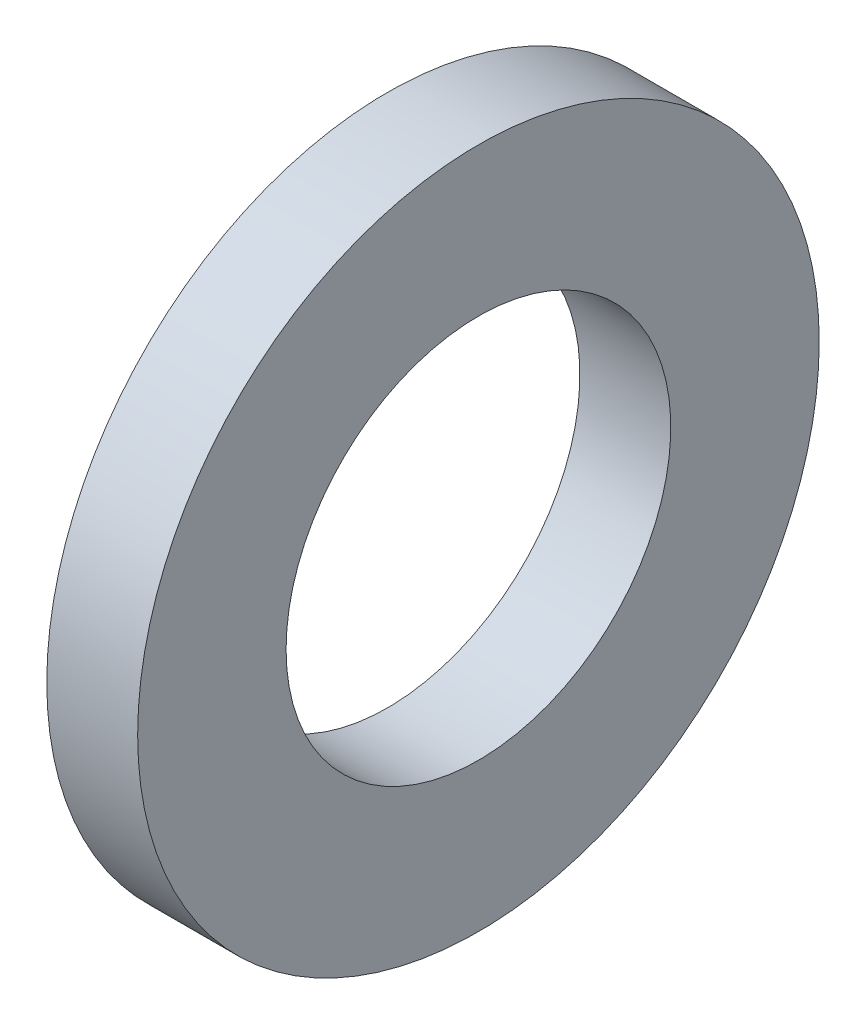
ISO-10303-21;
HEADER;
FILE_DESCRIPTION(('STEP AP214'),'2;1');
FILE_NAME('part.step','',(''),(''),'','','');
FILE_SCHEMA(('AUTOMOTIVE_DESIGN { 1 0 10303 214 1 1 1 1 }'));
ENDSEC;
DATA;
#1=APPLICATION_CONTEXT('core data for automotive mechanical design processes');
#2=APPLICATION_PROTOCOL_DEFINITION('international standard','automotive_design',2000,#1);
#3=PRODUCT_CONTEXT('',#1,'mechanical');
#4=PRODUCT('Part','Part','',(#3));
#5=PRODUCT_RELATED_PRODUCT_CATEGORY('part','',(#4));
#6=PRODUCT_DEFINITION_FORMATION('','',#4);
#7=PRODUCT_DEFINITION_CONTEXT('part definition',#1,'design');
#8=PRODUCT_DEFINITION('design','',#6,#7);
#9=PRODUCT_DEFINITION_SHAPE('','',#8);
#10=(LENGTH_UNIT() NAMED_UNIT(*) SI_UNIT(.MILLI.,.METRE.));
#11=(NAMED_UNIT(*) PLANE_ANGLE_UNIT() SI_UNIT($,.RADIAN.));
#12=(NAMED_UNIT(*) SI_UNIT($,.STERADIAN.) SOLID_ANGLE_UNIT());
#13=UNCERTAINTY_MEASURE_WITH_UNIT(LENGTH_MEASURE(1.E-05),#10,'distance_accuracy_value','');
#14=(GEOMETRIC_REPRESENTATION_CONTEXT(3) GLOBAL_UNCERTAINTY_ASSIGNED_CONTEXT((#13)) GLOBAL_UNIT_ASSIGNED_CONTEXT((#10,
#11,#12)) REPRESENTATION_CONTEXT('',''));
#15=CARTESIAN_POINT('',(0.,0.,0.));
#16=DIRECTION('',(0.,0.,1.));
#17=DIRECTION('',(1.,0.,0.));
#18=AXIS2_PLACEMENT_3D('',#15,#16,#17);
#19=CARTESIAN_POINT('',(0.,0.,0.));
#20=DIRECTION('',(1.,0.,0.));
#21=DIRECTION('',(0.,0.,-1.));
#22=AXIS2_PLACEMENT_3D('',#19,#20,#21);
#23=PLANE('',#22);
#24=CARTESIAN_POINT('',(0.,0.,0.));
#25=DIRECTION('',(1.,0.,0.));
#26=DIRECTION('',(0.,0.,-1.));
#27=AXIS2_PLACEMENT_3D('',#24,#25,#26);
#28=CIRCLE('',#27,5.715);
#29=CARTESIAN_POINT('',(0.,0.,5.715));
#30=VERTEX_POINT('',#29);
#31=EDGE_CURVE('E10',#30,#30,#28,.T.);
#32=ORIENTED_EDGE('',*,*,#31,.F.);
#33=EDGE_LOOP('',(#32));
#34=FACE_BOUND('',#33,.T.);
#35=CARTESIAN_POINT('',(0.,0.,0.));
#36=DIRECTION('',(1.,0.,0.));
#37=DIRECTION('',(0.,0.,-1.));
#38=AXIS2_PLACEMENT_3D('',#35,#36,#37);
#39=CIRCLE('',#38,3.2258);
#40=CARTESIAN_POINT('',(0.,0.,3.2258));
#41=VERTEX_POINT('',#40);
#42=EDGE_CURVE('E53',#41,#41,#39,.T.);
#43=ORIENTED_EDGE('',*,*,#42,.T.);
#44=EDGE_LOOP('',(#43));
#45=FACE_BOUND('',#44,.T.);
#46=ADVANCED_FACE('F45',(#34,#45),#23,.F.);
#47=CARTESIAN_POINT('',(0.762,0.,0.));
#48=DIRECTION('',(-1.,0.,0.));
#49=DIRECTION('',(0.,0.,1.));
#50=AXIS2_PLACEMENT_3D('',#47,#48,#49);
#51=CYLINDRICAL_SURFACE('',#50,5.715);
#52=CARTESIAN_POINT('',(1.524,0.,0.));
#53=DIRECTION('',(-1.,0.,0.));
#54=DIRECTION('',(0.,0.,1.));
#55=AXIS2_PLACEMENT_3D('',#52,#53,#54);
#56=CIRCLE('',#55,5.715);
#57=CARTESIAN_POINT('',(1.524,0.,5.715));
#58=VERTEX_POINT('',#57);
#59=EDGE_CURVE('E58',#58,#58,#56,.T.);
#60=CARTESIAN_POINT('',(0.,0.,5.715));
#61=CARTESIAN_POINT('',(0.015875,0.,5.715));
#62=CARTESIAN_POINT('',(0.03175,0.,5.715));
#63=CARTESIAN_POINT('',(0.0635,0.,5.715));
#64=CARTESIAN_POINT('',(0.0793750000000001,0.,5.715));
#65=CARTESIAN_POINT('',(0.111125,0.,5.715));
#66=CARTESIAN_POINT('',(0.127,0.,5.715));
#67=CARTESIAN_POINT('',(0.15875,0.,5.715));
#68=CARTESIAN_POINT('',(0.174625,0.,5.715));
#69=CARTESIAN_POINT('',(0.206375,0.,5.715));
#70=CARTESIAN_POINT('',(0.22225,0.,5.715));
#71=CARTESIAN_POINT('',(0.254,0.,5.715));
#72=CARTESIAN_POINT('',(0.269875,0.,5.715));
#73=CARTESIAN_POINT('',(0.301625,0.,5.715));
#74=CARTESIAN_POINT('',(0.3175,0.,5.715));
#75=CARTESIAN_POINT('',(0.34925,0.,5.715));
#76=CARTESIAN_POINT('',(0.365125,0.,5.715));
#77=CARTESIAN_POINT('',(0.396875,0.,5.715));
#78=CARTESIAN_POINT('',(0.41275,0.,5.715));
#79=CARTESIAN_POINT('',(0.4445,0.,5.715));
#80=CARTESIAN_POINT('',(0.460375,0.,5.715));
#81=CARTESIAN_POINT('',(0.492125,0.,5.715));
#82=CARTESIAN_POINT('',(0.508,0.,5.715));
#83=CARTESIAN_POINT('',(0.53975,0.,5.715));
#84=CARTESIAN_POINT('',(0.555625,0.,5.715));
#85=CARTESIAN_POINT('',(0.587375,0.,5.715));
#86=CARTESIAN_POINT('',(0.60325,0.,5.715));
#87=CARTESIAN_POINT('',(0.635,0.,5.715));
#88=CARTESIAN_POINT('',(0.650875,0.,5.715));
#89=CARTESIAN_POINT('',(0.682625,0.,5.715));
#90=CARTESIAN_POINT('',(0.6985,0.,5.715));
#91=CARTESIAN_POINT('',(0.73025,0.,5.715));
#92=CARTESIAN_POINT('',(0.746125,0.,5.715));
#93=CARTESIAN_POINT('',(0.777875,0.,5.715));
#94=CARTESIAN_POINT('',(0.79375,0.,5.715));
#95=CARTESIAN_POINT('',(0.8255,0.,5.715));
#96=CARTESIAN_POINT('',(0.841375,0.,5.715));
#97=CARTESIAN_POINT('',(0.873125,0.,5.715));
#98=CARTESIAN_POINT('',(0.889,0.,5.715));
#99=CARTESIAN_POINT('',(0.92075,0.,5.715));
#100=CARTESIAN_POINT('',(0.936625,0.,5.715));
#101=CARTESIAN_POINT('',(0.968375,0.,5.715));
#102=CARTESIAN_POINT('',(0.98425,0.,5.715));
#103=CARTESIAN_POINT('',(1.016,0.,5.715));
#104=CARTESIAN_POINT('',(1.031875,0.,5.715));
#105=CARTESIAN_POINT('',(1.063625,0.,5.715));
#106=CARTESIAN_POINT('',(1.0795,0.,5.715));
#107=CARTESIAN_POINT('',(1.11125,0.,5.715));
#108=CARTESIAN_POINT('',(1.127125,0.,5.715));
#109=CARTESIAN_POINT('',(1.158875,0.,5.715));
#110=CARTESIAN_POINT('',(1.17475,0.,5.715));
#111=CARTESIAN_POINT('',(1.2065,0.,5.715));
#112=CARTESIAN_POINT('',(1.222375,0.,5.715));
#113=CARTESIAN_POINT('',(1.254125,0.,5.715));
#114=CARTESIAN_POINT('',(1.27,0.,5.715));
#115=CARTESIAN_POINT('',(1.30175,0.,5.715));
#116=CARTESIAN_POINT('',(1.317625,0.,5.715));
#117=CARTESIAN_POINT('',(1.349375,0.,5.715));
#118=CARTESIAN_POINT('',(1.36525,0.,5.715));
#119=CARTESIAN_POINT('',(1.397,0.,5.715));
#120=CARTESIAN_POINT('',(1.412875,0.,5.715));
#121=CARTESIAN_POINT('',(1.444625,0.,5.715));
#122=CARTESIAN_POINT('',(1.4605,0.,5.715));
#123=CARTESIAN_POINT('',(1.49225,0.,5.715));
#124=CARTESIAN_POINT('',(1.508125,0.,5.715));
#125=CARTESIAN_POINT('',(1.524,0.,5.715));
#126=B_SPLINE_CURVE_WITH_KNOTS('',3,(#60,#61,#62,#63,#64,#65,#66,#67,#68,#69,#70,#71,#72,#73,
#74,#75,#76,#77,#78,#79,#80,#81,#82,#83,#84,#85,#86,#87,#88,#89,#90,#91,#92,#93,#94,#95,#96,#97,
#98,#99,#100,#101,#102,#103,#104,#105,#106,#107,#108,#109,#110,#111,#112,#113,#114,#115,#116,
#117,#118,#119,#120,#121,#122,#123,#124,#125),.UNSPECIFIED.,.F.,.F.,(4,2,2,2,2,2,2,2,2,2,2,2,2,
2,2,2,2,2,2,2,2,2,2,2,2,2,2,2,2,2,2,2,4),(0.,0.047625,0.0952500000000001,0.142875,0.1905,
0.238125,0.28575,0.333375,0.381,0.428625,0.47625,0.523875,0.5715,0.619125,0.66675,0.714375,
0.762,0.809625,0.85725,0.904875,0.9525,1.000125,1.04775,1.095375,1.143,1.190625,1.23825,
1.285875,1.3335,1.381125,1.42875,1.476375,1.524),.UNSPECIFIED.);
#127=EDGE_CURVE('BSEAM47',#30,#58,#126,.T.);
#128=ORIENTED_EDGE('',*,*,#31,.T.);
#129=ORIENTED_EDGE('',*,*,#59,.T.);
#130=ORIENTED_EDGE('',*,*,#127,.T.);
#131=ORIENTED_EDGE('',*,*,#127,.F.);
#132=EDGE_LOOP('',(#128,#130,#129,#131));
#133=FACE_BOUND('',#132,.T.);
#134=ADVANCED_FACE('F47',(#133),#51,.T.);
#135=CARTESIAN_POINT('',(0.762,0.,0.));
#136=DIRECTION('',(-1.,0.,0.));
#137=DIRECTION('',(0.,0.,1.));
#138=AXIS2_PLACEMENT_3D('',#135,#136,#137);
#139=CYLINDRICAL_SURFACE('',#138,3.2258);
#140=CARTESIAN_POINT('',(1.524,0.,0.));
#141=DIRECTION('',(-1.,0.,0.));
#142=DIRECTION('',(0.,0.,1.));
#143=AXIS2_PLACEMENT_3D('',#140,#141,#142);
#144=CIRCLE('',#143,3.2258);
#145=CARTESIAN_POINT('',(1.524,0.,3.2258));
#146=VERTEX_POINT('',#145);
#147=EDGE_CURVE('E63',#146,#146,#144,.T.);
#148=CARTESIAN_POINT('',(0.,0.,3.2258));
#149=CARTESIAN_POINT('',(0.015875,0.,3.2258));
#150=CARTESIAN_POINT('',(0.03175,0.,3.2258));
#151=CARTESIAN_POINT('',(0.0635,0.,3.2258));
#152=CARTESIAN_POINT('',(0.0793750000000001,0.,3.2258));
#153=CARTESIAN_POINT('',(0.111125,0.,3.2258));
#154=CARTESIAN_POINT('',(0.127,0.,3.2258));
#155=CARTESIAN_POINT('',(0.15875,0.,3.2258));
#156=CARTESIAN_POINT('',(0.174625,0.,3.2258));
#157=CARTESIAN_POINT('',(0.206375,0.,3.2258));
#158=CARTESIAN_POINT('',(0.22225,0.,3.2258));
#159=CARTESIAN_POINT('',(0.254,0.,3.2258));
#160=CARTESIAN_POINT('',(0.269875,0.,3.2258));
#161=CARTESIAN_POINT('',(0.301625,0.,3.2258));
#162=CARTESIAN_POINT('',(0.3175,0.,3.2258));
#163=CARTESIAN_POINT('',(0.34925,0.,3.2258));
#164=CARTESIAN_POINT('',(0.365125,0.,3.2258));
#165=CARTESIAN_POINT('',(0.396875,0.,3.2258));
#166=CARTESIAN_POINT('',(0.41275,0.,3.2258));
#167=CARTESIAN_POINT('',(0.4445,0.,3.2258));
#168=CARTESIAN_POINT('',(0.460375,0.,3.2258));
#169=CARTESIAN_POINT('',(0.492125,0.,3.2258));
#170=CARTESIAN_POINT('',(0.508,0.,3.2258));
#171=CARTESIAN_POINT('',(0.53975,0.,3.2258));
#172=CARTESIAN_POINT('',(0.555625,0.,3.2258));
#173=CARTESIAN_POINT('',(0.587375,0.,3.2258));
#174=CARTESIAN_POINT('',(0.60325,0.,3.2258));
#175=CARTESIAN_POINT('',(0.635,0.,3.2258));
#176=CARTESIAN_POINT('',(0.650875,0.,3.2258));
#177=CARTESIAN_POINT('',(0.682625,0.,3.2258));
#178=CARTESIAN_POINT('',(0.6985,0.,3.2258));
#179=CARTESIAN_POINT('',(0.73025,0.,3.2258));
#180=CARTESIAN_POINT('',(0.746125,0.,3.2258));
#181=CARTESIAN_POINT('',(0.777875,0.,3.2258));
#182=CARTESIAN_POINT('',(0.79375,0.,3.2258));
#183=CARTESIAN_POINT('',(0.8255,0.,3.2258));
#184=CARTESIAN_POINT('',(0.841375,0.,3.2258));
#185=CARTESIAN_POINT('',(0.873125,0.,3.2258));
#186=CARTESIAN_POINT('',(0.889,0.,3.2258));
#187=CARTESIAN_POINT('',(0.92075,0.,3.2258));
#188=CARTESIAN_POINT('',(0.936625,0.,3.2258));
#189=CARTESIAN_POINT('',(0.968375,0.,3.2258));
#190=CARTESIAN_POINT('',(0.98425,0.,3.2258));
#191=CARTESIAN_POINT('',(1.016,0.,3.2258));
#192=CARTESIAN_POINT('',(1.031875,0.,3.2258));
#193=CARTESIAN_POINT('',(1.063625,0.,3.2258));
#194=CARTESIAN_POINT('',(1.0795,0.,3.2258));
#195=CARTESIAN_POINT('',(1.11125,0.,3.2258));
#196=CARTESIAN_POINT('',(1.127125,0.,3.2258));
#197=CARTESIAN_POINT('',(1.158875,0.,3.2258));
#198=CARTESIAN_POINT('',(1.17475,0.,3.2258));
#199=CARTESIAN_POINT('',(1.2065,0.,3.2258));
#200=CARTESIAN_POINT('',(1.222375,0.,3.2258));
#201=CARTESIAN_POINT('',(1.254125,0.,3.2258));
#202=CARTESIAN_POINT('',(1.27,0.,3.2258));
#203=CARTESIAN_POINT('',(1.30175,0.,3.2258));
#204=CARTESIAN_POINT('',(1.317625,0.,3.2258));
#205=CARTESIAN_POINT('',(1.349375,0.,3.2258));
#206=CARTESIAN_POINT('',(1.36525,0.,3.2258));
#207=CARTESIAN_POINT('',(1.397,0.,3.2258));
#208=CARTESIAN_POINT('',(1.412875,0.,3.2258));
#209=CARTESIAN_POINT('',(1.444625,0.,3.2258));
#210=CARTESIAN_POINT('',(1.4605,0.,3.2258));
#211=CARTESIAN_POINT('',(1.49225,0.,3.2258));
#212=CARTESIAN_POINT('',(1.508125,0.,3.2258));
#213=CARTESIAN_POINT('',(1.524,0.,3.2258));
#214=B_SPLINE_CURVE_WITH_KNOTS('',3,(#148,#149,#150,#151,#152,#153,#154,#155,#156,#157,#158,
#159,#160,#161,#162,#163,#164,#165,#166,#167,#168,#169,#170,#171,#172,#173,#174,#175,#176,#177,
#178,#179,#180,#181,#182,#183,#184,#185,#186,#187,#188,#189,#190,#191,#192,#193,#194,#195,#196,
#197,#198,#199,#200,#201,#202,#203,#204,#205,#206,#207,#208,#209,#210,#211,#212,#213),
.UNSPECIFIED.,.F.,.F.,(4,2,2,2,2,2,2,2,2,2,2,2,2,2,2,2,2,2,2,2,2,2,2,2,2,2,2,2,2,2,2,2,4),(0.,
0.047625,0.0952500000000001,0.142875,0.1905,0.238125,0.28575,0.333375,0.381,0.428625,0.47625,
0.523875,0.5715,0.619125,0.66675,0.714375,0.762,0.809625,0.85725,0.904875,0.9525,1.000125,
1.04775,1.095375,1.143,1.190625,1.23825,1.285875,1.3335,1.381125,1.42875,1.476375,1.524),.UNSPECIFIED.);
#215=EDGE_CURVE('BSEAM73',#41,#146,#214,.T.);
#216=ORIENTED_EDGE('',*,*,#42,.F.);
#217=ORIENTED_EDGE('',*,*,#147,.F.);
#218=ORIENTED_EDGE('',*,*,#215,.T.);
#219=ORIENTED_EDGE('',*,*,#215,.F.);
#220=EDGE_LOOP('',(#216,#218,#217,#219));
#221=FACE_BOUND('',#220,.T.);
#222=ADVANCED_FACE('F73',(#221),#139,.F.);
#223=CARTESIAN_POINT('',(1.524,0.,0.));
#224=DIRECTION('',(-1.,0.,0.));
#225=DIRECTION('',(0.,0.,1.));
#226=AXIS2_PLACEMENT_3D('',#223,#224,#225);
#227=PLANE('',#226);
#228=ORIENTED_EDGE('',*,*,#147,.T.);
#229=EDGE_LOOP('',(#228));
#230=FACE_BOUND('',#229,.T.);
#231=ORIENTED_EDGE('',*,*,#59,.F.);
#232=EDGE_LOOP('',(#231));
#233=FACE_BOUND('',#232,.T.);
#234=ADVANCED_FACE('F70',(#230,#233),#227,.F.);
#235=CLOSED_SHELL('',(#46,#134,#222,#234));
#236=MANIFOLD_SOLID_BREP('B2',#235);
#237=ADVANCED_BREP_SHAPE_REPRESENTATION('',(#18,#236),#14);
#238=SHAPE_DEFINITION_REPRESENTATION(#9,#237);
ENDSEC;
END-ISO-10303-21;
